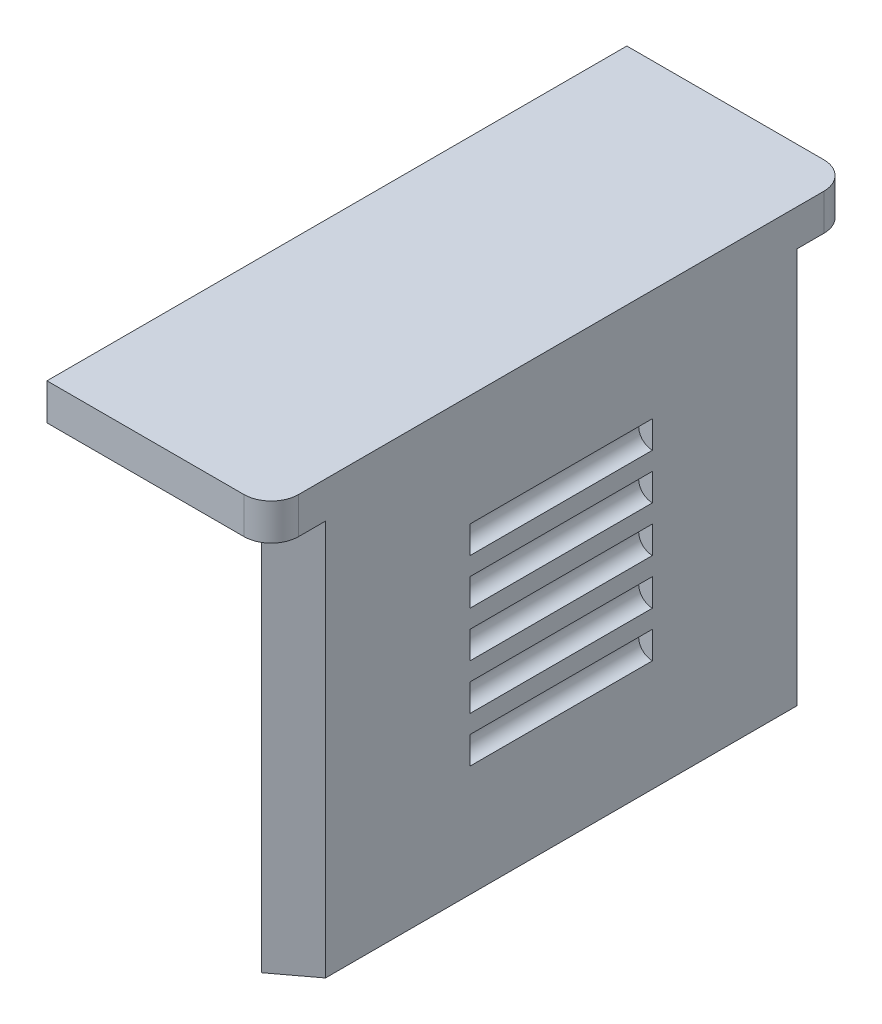
ISO-10303-21;
HEADER;
FILE_DESCRIPTION(('STEP AP214'),'2;1');
FILE_NAME('part.step','',(''),(''),'','','');
FILE_SCHEMA(('AUTOMOTIVE_DESIGN { 1 0 10303 214 1 1 1 1 }'));
ENDSEC;
DATA;
#1=APPLICATION_CONTEXT('core data for automotive mechanical design processes');
#2=APPLICATION_PROTOCOL_DEFINITION('international standard','automotive_design',2000,#1);
#3=PRODUCT_CONTEXT('',#1,'mechanical');
#4=PRODUCT('Part','Part','',(#3));
#5=PRODUCT_RELATED_PRODUCT_CATEGORY('part','',(#4));
#6=PRODUCT_DEFINITION_FORMATION('','',#4);
#7=PRODUCT_DEFINITION_CONTEXT('part definition',#1,'design');
#8=PRODUCT_DEFINITION('design','',#6,#7);
#9=PRODUCT_DEFINITION_SHAPE('','',#8);
#10=(LENGTH_UNIT() NAMED_UNIT(*) SI_UNIT(.MILLI.,.METRE.));
#11=(NAMED_UNIT(*) PLANE_ANGLE_UNIT() SI_UNIT($,.RADIAN.));
#12=(NAMED_UNIT(*) SI_UNIT($,.STERADIAN.) SOLID_ANGLE_UNIT());
#13=UNCERTAINTY_MEASURE_WITH_UNIT(LENGTH_MEASURE(1.E-05),#10,'distance_accuracy_value','');
#14=(GEOMETRIC_REPRESENTATION_CONTEXT(3) GLOBAL_UNCERTAINTY_ASSIGNED_CONTEXT((#13)) GLOBAL_UNIT_ASSIGNED_CONTEXT((#10,
#11,#12)) REPRESENTATION_CONTEXT('',''));
#15=CARTESIAN_POINT('',(0.,0.,0.));
#16=DIRECTION('',(0.,0.,1.));
#17=DIRECTION('',(1.,0.,0.));
#18=AXIS2_PLACEMENT_3D('',#15,#16,#17);
#19=CARTESIAN_POINT('',(-3.65222941321836,109.467949424705,104.21839123638));
#20=DIRECTION('',(1.,0.,0.));
#21=DIRECTION('',(0.,0.,-1.));
#22=AXIS2_PLACEMENT_3D('',#19,#20,#21);
#23=PLANE('',#22);
#24=DIRECTION('',(0.,0.,1.));
#25=VECTOR('',#24,1.);
#26=CARTESIAN_POINT('',(-3.65222941321836,97.867949424705,83.3183912363796));
#27=LINE('',#26,#25);
#28=CARTESIAN_POINT('',(-3.65222941321836,97.867949424705,83.3183912363796));
#29=VERTEX_POINT('',#28);
#30=CARTESIAN_POINT('',(-3.65222941321836,97.867949424705,93.3183912363796));
#31=VERTEX_POINT('',#30);
#32=EDGE_CURVE('E507',#29,#31,#27,.T.);
#33=ORIENTED_EDGE('',*,*,#32,.F.);
#34=DIRECTION('',(0.,-1.,0.));
#35=VECTOR('',#34,1.);
#36=CARTESIAN_POINT('',(-3.65222941321836,109.467949424705,83.3183912363796));
#37=LINE('',#36,#35);
#38=CARTESIAN_POINT('',(-3.65222941321836,96.367949424705,83.3183912363796));
#39=VERTEX_POINT('',#38);
#40=EDGE_CURVE('E205',#29,#39,#37,.T.);
#41=ORIENTED_EDGE('',*,*,#40,.T.);
#42=DIRECTION('',(0.,0.,1.));
#43=VECTOR('',#42,1.);
#44=CARTESIAN_POINT('',(-3.65222941321836,96.367949424705,83.3183912363796));
#45=LINE('',#44,#43);
#46=CARTESIAN_POINT('',(-3.65222941321836,96.367949424705,93.3183912363796));
#47=VERTEX_POINT('',#46);
#48=EDGE_CURVE('E506',#47,#39,#45,.F.);
#49=ORIENTED_EDGE('',*,*,#48,.F.);
#50=DIRECTION('',(0.,-1.,0.));
#51=VECTOR('',#50,1.);
#52=CARTESIAN_POINT('',(-3.65222941321836,109.467949424705,93.3183912363796));
#53=LINE('',#52,#51);
#54=EDGE_CURVE('E511',#31,#47,#53,.T.);
#55=ORIENTED_EDGE('',*,*,#54,.F.);
#56=EDGE_LOOP('',(#33,#41,#49,#55));
#57=FACE_BOUND('',#56,.T.);
#58=DIRECTION('',(0.,0.,1.));
#59=VECTOR('',#58,1.);
#60=CARTESIAN_POINT('',(-3.65222941321836,102.867949424705,83.3183912363796));
#61=LINE('',#60,#59);
#62=CARTESIAN_POINT('',(-3.65222941321836,102.867949424705,83.3183912363796));
#63=VERTEX_POINT('',#62);
#64=CARTESIAN_POINT('',(-3.65222941321836,102.867949424705,93.3183912363796));
#65=VERTEX_POINT('',#64);
#66=EDGE_CURVE('E526',#63,#65,#61,.T.);
#67=ORIENTED_EDGE('',*,*,#66,.F.);
#68=DIRECTION('',(0.,-1.,0.));
#69=VECTOR('',#68,1.);
#70=CARTESIAN_POINT('',(-3.65222941321836,109.467949424705,83.3183912363796));
#71=LINE('',#70,#69);
#72=CARTESIAN_POINT('',(-3.65222941321836,101.367949424705,83.3183912363796));
#73=VERTEX_POINT('',#72);
#74=EDGE_CURVE('E523',#63,#73,#71,.T.);
#75=ORIENTED_EDGE('',*,*,#74,.T.);
#76=DIRECTION('',(0.,0.,1.));
#77=VECTOR('',#76,1.);
#78=CARTESIAN_POINT('',(-3.65222941321836,101.367949424705,83.3183912363796));
#79=LINE('',#78,#77);
#80=CARTESIAN_POINT('',(-3.65222941321836,101.367949424705,93.3183912363796));
#81=VERTEX_POINT('',#80);
#82=EDGE_CURVE('E529',#81,#73,#79,.F.);
#83=ORIENTED_EDGE('',*,*,#82,.F.);
#84=DIRECTION('',(0.,-1.,0.));
#85=VECTOR('',#84,1.);
#86=CARTESIAN_POINT('',(-3.65222941321836,109.467949424705,93.3183912363796));
#87=LINE('',#86,#85);
#88=EDGE_CURVE('E531',#65,#81,#87,.T.);
#89=ORIENTED_EDGE('',*,*,#88,.F.);
#90=EDGE_LOOP('',(#67,#75,#83,#89));
#91=FACE_BOUND('',#90,.T.);
#92=DIRECTION('',(0.,0.,-1.));
#93=VECTOR('',#92,1.);
#94=CARTESIAN_POINT('',(-3.65222941321836,109.467949424705,104.21839123638));
#95=LINE('',#94,#93);
#96=CARTESIAN_POINT('',(-3.65222941321836,109.467949424705,75.3933912363796));
#97=VERTEX_POINT('',#96);
#98=CARTESIAN_POINT('',(-3.65222941321836,109.467949424705,73.9183912363796));
#99=VERTEX_POINT('',#98);
#100=EDGE_CURVE('E226',#97,#99,#95,.T.);
#101=ORIENTED_EDGE('',*,*,#100,.T.);
#102=DIRECTION('',(0.,1.,0.));
#103=VECTOR('',#102,1.);
#104=CARTESIAN_POINT('',(-3.65222941321836,109.467949424705,73.9183912363796));
#105=LINE('',#104,#103);
#106=CARTESIAN_POINT('',(-3.65222941321836,111.467949424705,73.9183912363796));
#107=VERTEX_POINT('',#106);
#108=EDGE_CURVE('E373',#99,#107,#105,.T.);
#109=ORIENTED_EDGE('',*,*,#108,.T.);
#110=DIRECTION('',(0.,0.,-1.));
#111=VECTOR('',#110,1.);
#112=CARTESIAN_POINT('',(-3.65222941321836,111.467949424705,104.21839123638));
#113=LINE('',#112,#111);
#114=CARTESIAN_POINT('',(-3.65222941321836,111.467949424705,102.71839123638));
#115=VERTEX_POINT('',#114);
#116=EDGE_CURVE('E252',#115,#107,#113,.T.);
#117=ORIENTED_EDGE('',*,*,#116,.F.);
#118=DIRECTION('',(0.,1.,0.));
#119=VECTOR('',#118,1.);
#120=CARTESIAN_POINT('',(-3.65222941321836,109.467949424705,102.71839123638));
#121=LINE('',#120,#119);
#122=CARTESIAN_POINT('',(-3.65222941321836,109.467949424705,102.71839123638));
#123=VERTEX_POINT('',#122);
#124=EDGE_CURVE('E221',#115,#123,#121,.F.);
#125=ORIENTED_EDGE('',*,*,#124,.T.);
#126=CARTESIAN_POINT('',(-3.65222941321836,109.467949424705,101.24339123638));
#127=VERTEX_POINT('',#126);
#128=EDGE_CURVE('E222',#123,#127,#95,.T.);
#129=ORIENTED_EDGE('',*,*,#128,.T.);
#130=DIRECTION('',(0.,1.,0.));
#131=VECTOR('',#130,1.);
#132=CARTESIAN_POINT('',(-3.65222941321836,87.767949424705,101.24339123638));
#133=LINE('',#132,#131);
#134=CARTESIAN_POINT('',(-3.65222941321836,87.767949424705,101.24339123638));
#135=VERTEX_POINT('',#134);
#136=EDGE_CURVE('E249',#135,#127,#133,.T.);
#137=ORIENTED_EDGE('',*,*,#136,.F.);
#138=DIRECTION('',(0.,0.,1.));
#139=VECTOR('',#138,1.);
#140=CARTESIAN_POINT('',(-3.65222941321836,87.767949424705,75.3933912363796));
#141=LINE('',#140,#139);
#142=CARTESIAN_POINT('',(-3.65222941321836,87.767949424705,75.3933912363796));
#143=VERTEX_POINT('',#142);
#144=EDGE_CURVE('E259',#143,#135,#141,.T.);
#145=ORIENTED_EDGE('',*,*,#144,.F.);
#146=DIRECTION('',(0.,1.,0.));
#147=VECTOR('',#146,1.);
#148=CARTESIAN_POINT('',(-3.65222941321836,87.767949424705,75.3933912363796));
#149=LINE('',#148,#147);
#150=EDGE_CURVE('E261',#143,#97,#149,.T.);
#151=ORIENTED_EDGE('',*,*,#150,.T.);
#152=EDGE_LOOP('',(#101,#109,#117,#125,#129,#137,#145,#151));
#153=FACE_BOUND('',#152,.T.);
#154=DIRECTION('',(0.,0.,1.));
#155=VECTOR('',#154,1.);
#156=CARTESIAN_POINT('',(-3.65222941321836,105.367949424705,83.3183912363796));
#157=LINE('',#156,#155);
#158=CARTESIAN_POINT('',(-3.65222941321836,105.367949424705,83.3183912363796));
#159=VERTEX_POINT('',#158);
#160=CARTESIAN_POINT('',(-3.65222941321836,105.367949424705,93.3183912363796));
#161=VERTEX_POINT('',#160);
#162=EDGE_CURVE('E536',#159,#161,#157,.T.);
#163=ORIENTED_EDGE('',*,*,#162,.F.);
#164=DIRECTION('',(0.,-1.,0.));
#165=VECTOR('',#164,1.);
#166=CARTESIAN_POINT('',(-3.65222941321836,109.467949424705,83.3183912363796));
#167=LINE('',#166,#165);
#168=CARTESIAN_POINT('',(-3.65222941321836,103.867949424705,83.3183912363796));
#169=VERTEX_POINT('',#168);
#170=EDGE_CURVE('E533',#159,#169,#167,.T.);
#171=ORIENTED_EDGE('',*,*,#170,.T.);
#172=DIRECTION('',(0.,0.,1.));
#173=VECTOR('',#172,1.);
#174=CARTESIAN_POINT('',(-3.65222941321836,103.867949424705,83.3183912363796));
#175=LINE('',#174,#173);
#176=CARTESIAN_POINT('',(-3.65222941321836,103.867949424705,93.3183912363796));
#177=VERTEX_POINT('',#176);
#178=EDGE_CURVE('E405',#177,#169,#175,.F.);
#179=ORIENTED_EDGE('',*,*,#178,.F.);
#180=DIRECTION('',(0.,-1.,0.));
#181=VECTOR('',#180,1.);
#182=CARTESIAN_POINT('',(-3.65222941321836,109.467949424705,93.3183912363796));
#183=LINE('',#182,#181);
#184=EDGE_CURVE('E402',#161,#177,#183,.T.);
#185=ORIENTED_EDGE('',*,*,#184,.F.);
#186=EDGE_LOOP('',(#163,#171,#179,#185));
#187=FACE_BOUND('',#186,.T.);
#188=DIRECTION('',(0.,0.,1.));
#189=VECTOR('',#188,1.);
#190=CARTESIAN_POINT('',(-3.65222941321836,100.367949424705,83.3183912363796));
#191=LINE('',#190,#189);
#192=CARTESIAN_POINT('',(-3.65222941321836,100.367949424705,83.3183912363796));
#193=VERTEX_POINT('',#192);
#194=CARTESIAN_POINT('',(-3.65222941321836,100.367949424705,93.3183912363796));
#195=VERTEX_POINT('',#194);
#196=EDGE_CURVE('E516',#193,#195,#191,.T.);
#197=ORIENTED_EDGE('',*,*,#196,.F.);
#198=DIRECTION('',(0.,-1.,0.));
#199=VECTOR('',#198,1.);
#200=CARTESIAN_POINT('',(-3.65222941321836,109.467949424705,83.3183912363796));
#201=LINE('',#200,#199);
#202=CARTESIAN_POINT('',(-3.65222941321836,98.867949424705,83.3183912363796));
#203=VERTEX_POINT('',#202);
#204=EDGE_CURVE('E513',#193,#203,#201,.T.);
#205=ORIENTED_EDGE('',*,*,#204,.T.);
#206=DIRECTION('',(0.,0.,1.));
#207=VECTOR('',#206,1.);
#208=CARTESIAN_POINT('',(-3.65222941321836,98.867949424705,83.3183912363796));
#209=LINE('',#208,#207);
#210=CARTESIAN_POINT('',(-3.65222941321836,98.867949424705,93.3183912363796));
#211=VERTEX_POINT('',#210);
#212=EDGE_CURVE('E519',#211,#203,#209,.F.);
#213=ORIENTED_EDGE('',*,*,#212,.F.);
#214=DIRECTION('',(0.,-1.,0.));
#215=VECTOR('',#214,1.);
#216=CARTESIAN_POINT('',(-3.65222941321836,109.467949424705,93.3183912363796));
#217=LINE('',#216,#215);
#218=EDGE_CURVE('E521',#195,#211,#217,.T.);
#219=ORIENTED_EDGE('',*,*,#218,.F.);
#220=EDGE_LOOP('',(#197,#205,#213,#219));
#221=FACE_BOUND('',#220,.T.);
#222=DIRECTION('',(0.,0.,1.));
#223=VECTOR('',#222,1.);
#224=CARTESIAN_POINT('',(-3.65222941321836,95.367949424705,83.3183912363796));
#225=LINE('',#224,#223);
#226=CARTESIAN_POINT('',(-3.65222941321836,95.367949424705,83.3183912363796));
#227=VERTEX_POINT('',#226);
#228=CARTESIAN_POINT('',(-3.65222941321836,95.367949424705,93.3183912363796));
#229=VERTEX_POINT('',#228);
#230=EDGE_CURVE('E211',#227,#229,#225,.T.);
#231=ORIENTED_EDGE('',*,*,#230,.F.);
#232=DIRECTION('',(0.,-1.,0.));
#233=VECTOR('',#232,1.);
#234=CARTESIAN_POINT('',(-3.65222941321836,109.467949424705,83.3183912363796));
#235=LINE('',#234,#233);
#236=CARTESIAN_POINT('',(-3.65222941321836,93.867949424705,83.3183912363796));
#237=VERTEX_POINT('',#236);
#238=EDGE_CURVE('E215',#227,#237,#235,.T.);
#239=ORIENTED_EDGE('',*,*,#238,.T.);
#240=DIRECTION('',(0.,0.,1.));
#241=VECTOR('',#240,1.);
#242=CARTESIAN_POINT('',(-3.65222941321836,93.867949424705,83.3183912363796));
#243=LINE('',#242,#241);
#244=CARTESIAN_POINT('',(-3.65222941321836,93.867949424705,93.3183912363796));
#245=VERTEX_POINT('',#244);
#246=EDGE_CURVE('E204',#245,#237,#243,.F.);
#247=ORIENTED_EDGE('',*,*,#246,.F.);
#248=DIRECTION('',(0.,-1.,0.));
#249=VECTOR('',#248,1.);
#250=CARTESIAN_POINT('',(-3.65222941321836,109.467949424705,93.3183912363796));
#251=LINE('',#250,#249);
#252=EDGE_CURVE('E196',#229,#245,#251,.T.);
#253=ORIENTED_EDGE('',*,*,#252,.F.);
#254=EDGE_LOOP('',(#231,#239,#247,#253));
#255=FACE_BOUND('',#254,.T.);
#256=ADVANCED_FACE('F33',(#57,#91,#153,#187,#221,#255),#23,.T.);
#257=CARTESIAN_POINT('',(0.,109.467949424705,0.));
#258=DIRECTION('',(0.,1.,0.));
#259=DIRECTION('',(0.,0.,1.));
#260=AXIS2_PLACEMENT_3D('',#257,#258,#259);
#261=PLANE('',#260);
#262=DIRECTION('',(-1.,0.,0.));
#263=VECTOR('',#262,1.);
#264=CARTESIAN_POINT('',(-3.65222941321836,109.467949424705,72.4183912363796));
#265=LINE('',#264,#263);
#266=CARTESIAN_POINT('',(-5.15222941321836,109.467949424705,72.4183912363796));
#267=VERTEX_POINT('',#266);
#268=CARTESIAN_POINT('',(-15.9522294132184,109.467949424705,72.4183912363796));
#269=VERTEX_POINT('',#268);
#270=EDGE_CURVE('E225',#267,#269,#265,.T.);
#271=ORIENTED_EDGE('',*,*,#270,.F.);
#272=CARTESIAN_POINT('',(-5.15222941321836,109.467949424705,73.9183912363796));
#273=DIRECTION('',(0.,1.,0.));
#274=DIRECTION('',(0.,0.,1.));
#275=AXIS2_PLACEMENT_3D('',#272,#273,#274);
#276=CIRCLE('',#275,1.5);
#277=EDGE_CURVE('E41',#267,#99,#276,.F.);
#278=ORIENTED_EDGE('',*,*,#277,.T.);
#279=ORIENTED_EDGE('',*,*,#100,.F.);
#280=DIRECTION('',(0.799999999999999,0.,0.600000000000001));
#281=VECTOR('',#280,1.);
#282=CARTESIAN_POINT('',(-3.65222941321836,109.467949424705,75.3933912363796));
#283=LINE('',#282,#281);
#284=CARTESIAN_POINT('',(-5.65222941321836,109.467949424705,73.8933912363796));
#285=VERTEX_POINT('',#284);
#286=EDGE_CURVE('E255',#285,#97,#283,.T.);
#287=ORIENTED_EDGE('',*,*,#286,.F.);
#288=DIRECTION('',(0.,0.,-1.));
#289=VECTOR('',#288,1.);
#290=CARTESIAN_POINT('',(-5.65222941321836,109.467949424705,102.74339123638));
#291=LINE('',#290,#289);
#292=CARTESIAN_POINT('',(-5.65222941321836,109.467949424705,80.8183912363796));
#293=VERTEX_POINT('',#292);
#294=EDGE_CURVE('E245',#293,#285,#291,.T.);
#295=ORIENTED_EDGE('',*,*,#294,.F.);
#296=DIRECTION('',(1.,0.,0.));
#297=VECTOR('',#296,1.);
#298=CARTESIAN_POINT('',(-5.65222941321836,109.467949424705,80.8183912363796));
#299=LINE('',#298,#297);
#300=CARTESIAN_POINT('',(-6.65222941321836,109.467949424705,80.8183912363796));
#301=VERTEX_POINT('',#300);
#302=EDGE_CURVE('E296',#301,#293,#299,.T.);
#303=ORIENTED_EDGE('',*,*,#302,.F.);
#304=DIRECTION('',(0.,0.,-1.));
#305=VECTOR('',#304,1.);
#306=CARTESIAN_POINT('',(-6.65222941321836,109.467949424705,95.8183912363796));
#307=LINE('',#306,#305);
#308=CARTESIAN_POINT('',(-6.65222941321836,109.467949424705,95.8183912363796));
#309=VERTEX_POINT('',#308);
#310=EDGE_CURVE('E300',#309,#301,#307,.T.);
#311=ORIENTED_EDGE('',*,*,#310,.F.);
#312=DIRECTION('',(-1.,0.,0.));
#313=VECTOR('',#312,1.);
#314=CARTESIAN_POINT('',(-5.65222941321836,109.467949424705,95.8183912363796));
#315=LINE('',#314,#313);
#316=CARTESIAN_POINT('',(-5.65222941321836,109.467949424705,95.8183912363796));
#317=VERTEX_POINT('',#316);
#318=EDGE_CURVE('E303',#317,#309,#315,.T.);
#319=ORIENTED_EDGE('',*,*,#318,.F.);
#320=CARTESIAN_POINT('',(-5.65222941321836,109.467949424705,102.74339123638));
#321=VERTEX_POINT('',#320);
#322=EDGE_CURVE('E260',#321,#317,#291,.T.);
#323=ORIENTED_EDGE('',*,*,#322,.F.);
#324=DIRECTION('',(-0.799999999999999,0.,0.600000000000001));
#325=VECTOR('',#324,1.);
#326=CARTESIAN_POINT('',(-3.65222941321836,109.467949424705,101.24339123638));
#327=LINE('',#326,#325);
#328=EDGE_CURVE('E242',#127,#321,#327,.T.);
#329=ORIENTED_EDGE('',*,*,#328,.F.);
#330=ORIENTED_EDGE('',*,*,#128,.F.);
#331=CARTESIAN_POINT('',(-5.15222941321836,109.467949424705,102.71839123638));
#332=DIRECTION('',(0.,1.,0.));
#333=DIRECTION('',(0.,0.,1.));
#334=AXIS2_PLACEMENT_3D('',#331,#332,#333);
#335=CIRCLE('',#334,1.5);
#336=CARTESIAN_POINT('',(-5.15222941321836,109.467949424705,104.21839123638));
#337=VERTEX_POINT('',#336);
#338=EDGE_CURVE('E48',#123,#337,#335,.F.);
#339=ORIENTED_EDGE('',*,*,#338,.T.);
#340=DIRECTION('',(1.,0.,0.));
#341=VECTOR('',#340,1.);
#342=CARTESIAN_POINT('',(-15.9522294132184,109.467949424705,104.21839123638));
#343=LINE('',#342,#341);
#344=CARTESIAN_POINT('',(-15.9522294132184,109.467949424705,104.21839123638));
#345=VERTEX_POINT('',#344);
#346=EDGE_CURVE('E391',#345,#337,#343,.T.);
#347=ORIENTED_EDGE('',*,*,#346,.F.);
#348=DIRECTION('',(0.,0.,1.));
#349=VECTOR('',#348,1.);
#350=CARTESIAN_POINT('',(-15.9522294132184,109.467949424705,72.4183912363796));
#351=LINE('',#350,#349);
#352=EDGE_CURVE('E409',#269,#345,#351,.T.);
#353=ORIENTED_EDGE('',*,*,#352,.F.);
#354=EDGE_LOOP('',(#271,#278,#279,#287,#295,#303,#311,#319,#323,#329,#330,#339,#347,#353));
#355=FACE_BOUND('',#354,.T.);
#356=ADVANCED_FACE('F351',(#355),#261,.F.);
#357=CARTESIAN_POINT('',(-5.65222941321836,87.767949424705,102.74339123638));
#358=DIRECTION('',(1.,0.,0.));
#359=DIRECTION('',(0.,0.,-1.));
#360=AXIS2_PLACEMENT_3D('',#357,#358,#359);
#361=PLANE('',#360);
#362=DIRECTION('',(0.,1.,0.));
#363=VECTOR('',#362,1.);
#364=CARTESIAN_POINT('',(-5.65222941321836,89.467949424705,95.8183912363796));
#365=LINE('',#364,#363);
#366=CARTESIAN_POINT('',(-5.65222941321836,89.467949424705,95.8183912363796));
#367=VERTEX_POINT('',#366);
#368=EDGE_CURVE('E246',#367,#317,#365,.T.);
#369=ORIENTED_EDGE('',*,*,#368,.F.);
#370=DIRECTION('',(0.,0.,1.));
#371=VECTOR('',#370,1.);
#372=CARTESIAN_POINT('',(-5.65222941321836,89.467949424705,95.8183912363796));
#373=LINE('',#372,#371);
#374=CARTESIAN_POINT('',(-5.65222941321836,89.467949424705,80.8183912363796));
#375=VERTEX_POINT('',#374);
#376=EDGE_CURVE('E299',#375,#367,#373,.T.);
#377=ORIENTED_EDGE('',*,*,#376,.F.);
#378=DIRECTION('',(0.,1.,0.));
#379=VECTOR('',#378,1.);
#380=CARTESIAN_POINT('',(-5.65222941321836,89.467949424705,80.8183912363796));
#381=LINE('',#380,#379);
#382=EDGE_CURVE('E293',#375,#293,#381,.T.);
#383=ORIENTED_EDGE('',*,*,#382,.T.);
#384=ORIENTED_EDGE('',*,*,#294,.T.);
#385=DIRECTION('',(0.,1.,0.));
#386=VECTOR('',#385,1.);
#387=CARTESIAN_POINT('',(-5.65222941321836,87.767949424705,73.8933912363796));
#388=LINE('',#387,#386);
#389=CARTESIAN_POINT('',(-5.65222941321836,87.767949424705,73.8933912363796));
#390=VERTEX_POINT('',#389);
#391=EDGE_CURVE('E266',#390,#285,#388,.T.);
#392=ORIENTED_EDGE('',*,*,#391,.F.);
#393=DIRECTION('',(0.,0.,-1.));
#394=VECTOR('',#393,1.);
#395=CARTESIAN_POINT('',(-5.65222941321836,87.767949424705,102.74339123638));
#396=LINE('',#395,#394);
#397=CARTESIAN_POINT('',(-5.65222941321836,87.767949424705,102.74339123638));
#398=VERTEX_POINT('',#397);
#399=EDGE_CURVE('E277',#398,#390,#396,.T.);
#400=ORIENTED_EDGE('',*,*,#399,.F.);
#401=DIRECTION('',(0.,1.,0.));
#402=VECTOR('',#401,1.);
#403=CARTESIAN_POINT('',(-5.65222941321836,87.767949424705,102.74339123638));
#404=LINE('',#403,#402);
#405=EDGE_CURVE('E231',#398,#321,#404,.T.);
#406=ORIENTED_EDGE('',*,*,#405,.T.);
#407=ORIENTED_EDGE('',*,*,#322,.T.);
#408=EDGE_LOOP('',(#369,#377,#383,#384,#392,#400,#406,#407));
#409=FACE_BOUND('',#408,.T.);
#410=ADVANCED_FACE('F357',(#409),#361,.F.);
#411=CARTESIAN_POINT('',(-15.9522294132184,109.467949424705,104.21839123638));
#412=DIRECTION('',(0.,0.,1.));
#413=DIRECTION('',(1.,0.,0.));
#414=AXIS2_PLACEMENT_3D('',#411,#412,#413);
#415=PLANE('',#414);
#416=ORIENTED_EDGE('',*,*,#346,.T.);
#417=DIRECTION('',(0.,1.,0.));
#418=VECTOR('',#417,1.);
#419=CARTESIAN_POINT('',(-5.15222941321836,109.467949424705,104.21839123638));
#420=LINE('',#419,#418);
#421=CARTESIAN_POINT('',(-5.15222941321836,111.467949424705,104.21839123638));
#422=VERTEX_POINT('',#421);
#423=EDGE_CURVE('E11',#337,#422,#420,.T.);
#424=ORIENTED_EDGE('',*,*,#423,.T.);
#425=DIRECTION('',(1.,0.,0.));
#426=VECTOR('',#425,1.);
#427=CARTESIAN_POINT('',(-15.9522294132184,111.467949424705,104.21839123638));
#428=LINE('',#427,#426);
#429=CARTESIAN_POINT('',(-15.9522294132184,111.467949424705,104.21839123638));
#430=VERTEX_POINT('',#429);
#431=EDGE_CURVE('E239',#430,#422,#428,.T.);
#432=ORIENTED_EDGE('',*,*,#431,.F.);
#433=DIRECTION('',(0.,1.,0.));
#434=VECTOR('',#433,1.);
#435=CARTESIAN_POINT('',(-15.9522294132184,109.467949424705,104.21839123638));
#436=LINE('',#435,#434);
#437=EDGE_CURVE('E401',#345,#430,#436,.T.);
#438=ORIENTED_EDGE('',*,*,#437,.F.);
#439=EDGE_LOOP('',(#416,#424,#432,#438));
#440=FACE_BOUND('',#439,.T.);
#441=ADVANCED_FACE('F390',(#440),#415,.T.);
#442=CARTESIAN_POINT('',(-15.9522294132184,109.467949424705,72.4183912363796));
#443=DIRECTION('',(-1.,0.,0.));
#444=DIRECTION('',(0.,0.,1.));
#445=AXIS2_PLACEMENT_3D('',#442,#443,#444);
#446=PLANE('',#445);
#447=DIRECTION('',(0.,0.,1.));
#448=VECTOR('',#447,1.);
#449=CARTESIAN_POINT('',(-15.9522294132184,111.467949424705,72.4183912363796));
#450=LINE('',#449,#448);
#451=CARTESIAN_POINT('',(-15.9522294132184,111.467949424705,72.4183912363796));
#452=VERTEX_POINT('',#451);
#453=EDGE_CURVE('E396',#452,#430,#450,.T.);
#454=ORIENTED_EDGE('',*,*,#453,.F.);
#455=DIRECTION('',(0.,1.,0.));
#456=VECTOR('',#455,1.);
#457=CARTESIAN_POINT('',(-15.9522294132184,109.467949424705,72.4183912363796));
#458=LINE('',#457,#456);
#459=EDGE_CURVE('E240',#269,#452,#458,.T.);
#460=ORIENTED_EDGE('',*,*,#459,.F.);
#461=ORIENTED_EDGE('',*,*,#352,.T.);
#462=ORIENTED_EDGE('',*,*,#437,.T.);
#463=EDGE_LOOP('',(#454,#460,#461,#462));
#464=FACE_BOUND('',#463,.T.);
#465=ADVANCED_FACE('F413',(#464),#446,.T.);
#466=CARTESIAN_POINT('',(-3.65222941321836,109.467949424705,72.4183912363796));
#467=DIRECTION('',(0.,0.,-1.));
#468=DIRECTION('',(-1.,0.,0.));
#469=AXIS2_PLACEMENT_3D('',#466,#467,#468);
#470=PLANE('',#469);
#471=DIRECTION('',(-1.,0.,0.));
#472=VECTOR('',#471,1.);
#473=CARTESIAN_POINT('',(-3.65222941321836,111.467949424705,72.4183912363796));
#474=LINE('',#473,#472);
#475=CARTESIAN_POINT('',(-5.15222941321836,111.467949424705,72.4183912363796));
#476=VERTEX_POINT('',#475);
#477=EDGE_CURVE('E398',#476,#452,#474,.T.);
#478=ORIENTED_EDGE('',*,*,#477,.F.);
#479=DIRECTION('',(0.,1.,0.));
#480=VECTOR('',#479,1.);
#481=CARTESIAN_POINT('',(-5.15222941321836,109.467949424705,72.4183912363796));
#482=LINE('',#481,#480);
#483=EDGE_CURVE('E56',#476,#267,#482,.F.);
#484=ORIENTED_EDGE('',*,*,#483,.T.);
#485=ORIENTED_EDGE('',*,*,#270,.T.);
#486=ORIENTED_EDGE('',*,*,#459,.T.);
#487=EDGE_LOOP('',(#478,#484,#485,#486));
#488=FACE_BOUND('',#487,.T.);
#489=ADVANCED_FACE('F362',(#488),#470,.T.);
#490=CARTESIAN_POINT('',(0.,111.467949424705,0.));
#491=DIRECTION('',(0.,1.,0.));
#492=DIRECTION('',(0.,0.,1.));
#493=AXIS2_PLACEMENT_3D('',#490,#491,#492);
#494=PLANE('',#493);
#495=ORIENTED_EDGE('',*,*,#116,.T.);
#496=CARTESIAN_POINT('',(-5.15222941321836,111.467949424705,73.9183912363796));
#497=DIRECTION('',(0.,1.,0.));
#498=DIRECTION('',(0.,0.,1.));
#499=AXIS2_PLACEMENT_3D('',#496,#497,#498);
#500=CIRCLE('',#499,1.5);
#501=EDGE_CURVE('E377',#107,#476,#500,.T.);
#502=ORIENTED_EDGE('',*,*,#501,.T.);
#503=ORIENTED_EDGE('',*,*,#477,.T.);
#504=ORIENTED_EDGE('',*,*,#453,.T.);
#505=ORIENTED_EDGE('',*,*,#431,.T.);
#506=CARTESIAN_POINT('',(-5.15222941321836,111.467949424705,102.71839123638));
#507=DIRECTION('',(0.,1.,0.));
#508=DIRECTION('',(0.,0.,1.));
#509=AXIS2_PLACEMENT_3D('',#506,#507,#508);
#510=CIRCLE('',#509,1.5);
#511=EDGE_CURVE('E379',#422,#115,#510,.T.);
#512=ORIENTED_EDGE('',*,*,#511,.T.);
#513=EDGE_LOOP('',(#495,#502,#503,#504,#505,#512));
#514=FACE_BOUND('',#513,.T.);
#515=ADVANCED_FACE('F394',(#514),#494,.T.);
#516=CARTESIAN_POINT('',(-3.65222941321836,87.767949424705,101.24339123638));
#517=DIRECTION('',(-0.600000000000001,0.,-0.799999999999999));
#518=DIRECTION('',(-0.799999999999999,0.,0.600000000000001));
#519=AXIS2_PLACEMENT_3D('',#516,#517,#518);
#520=PLANE('',#519);
#521=ORIENTED_EDGE('',*,*,#328,.T.);
#522=ORIENTED_EDGE('',*,*,#405,.F.);
#523=DIRECTION('',(-0.799999999999999,0.,0.600000000000001));
#524=VECTOR('',#523,1.);
#525=CARTESIAN_POINT('',(-3.65222941321836,87.767949424705,101.24339123638));
#526=LINE('',#525,#524);
#527=EDGE_CURVE('E280',#135,#398,#526,.T.);
#528=ORIENTED_EDGE('',*,*,#527,.F.);
#529=ORIENTED_EDGE('',*,*,#136,.T.);
#530=EDGE_LOOP('',(#521,#522,#528,#529));
#531=FACE_BOUND('',#530,.T.);
#532=ADVANCED_FACE('F418',(#531),#520,.F.);
#533=CARTESIAN_POINT('',(-3.65222941321836,87.767949424705,75.3933912363796));
#534=DIRECTION('',(-0.600000000000001,0.,0.799999999999999));
#535=DIRECTION('',(0.799999999999999,0.,0.600000000000001));
#536=AXIS2_PLACEMENT_3D('',#533,#534,#535);
#537=PLANE('',#536);
#538=ORIENTED_EDGE('',*,*,#286,.T.);
#539=ORIENTED_EDGE('',*,*,#150,.F.);
#540=DIRECTION('',(0.799999999999999,0.,0.600000000000001));
#541=VECTOR('',#540,1.);
#542=CARTESIAN_POINT('',(-3.65222941321836,87.767949424705,75.3933912363796));
#543=LINE('',#542,#541);
#544=EDGE_CURVE('E273',#390,#143,#543,.T.);
#545=ORIENTED_EDGE('',*,*,#544,.F.);
#546=ORIENTED_EDGE('',*,*,#391,.T.);
#547=EDGE_LOOP('',(#538,#539,#545,#546));
#548=FACE_BOUND('',#547,.T.);
#549=ADVANCED_FACE('F427',(#548),#537,.F.);
#550=CARTESIAN_POINT('',(0.,87.767949424705,0.));
#551=DIRECTION('',(0.,-1.,0.));
#552=DIRECTION('',(0.,0.,-1.));
#553=AXIS2_PLACEMENT_3D('',#550,#551,#552);
#554=PLANE('',#553);
#555=ORIENTED_EDGE('',*,*,#144,.T.);
#556=ORIENTED_EDGE('',*,*,#527,.T.);
#557=ORIENTED_EDGE('',*,*,#399,.T.);
#558=ORIENTED_EDGE('',*,*,#544,.T.);
#559=EDGE_LOOP('',(#555,#556,#557,#558));
#560=FACE_BOUND('',#559,.T.);
#561=ADVANCED_FACE('F434',(#560),#554,.T.);
#562=CARTESIAN_POINT('',(-5.65222941321836,89.467949424705,95.8183912363796));
#563=DIRECTION('',(0.,0.,-1.));
#564=DIRECTION('',(-1.,0.,0.));
#565=AXIS2_PLACEMENT_3D('',#562,#563,#564);
#566=PLANE('',#565);
#567=ORIENTED_EDGE('',*,*,#318,.T.);
#568=DIRECTION('',(0.,1.,0.));
#569=VECTOR('',#568,1.);
#570=CARTESIAN_POINT('',(-6.65222941321836,89.467949424705,95.8183912363796));
#571=LINE('',#570,#569);
#572=CARTESIAN_POINT('',(-6.65222941321836,89.467949424705,95.8183912363796));
#573=VERTEX_POINT('',#572);
#574=EDGE_CURVE('E287',#573,#309,#571,.T.);
#575=ORIENTED_EDGE('',*,*,#574,.F.);
#576=DIRECTION('',(-1.,0.,0.));
#577=VECTOR('',#576,1.);
#578=CARTESIAN_POINT('',(-5.65222941321836,89.467949424705,95.8183912363796));
#579=LINE('',#578,#577);
#580=EDGE_CURVE('E311',#367,#573,#579,.T.);
#581=ORIENTED_EDGE('',*,*,#580,.F.);
#582=ORIENTED_EDGE('',*,*,#368,.T.);
#583=EDGE_LOOP('',(#567,#575,#581,#582));
#584=FACE_BOUND('',#583,.T.);
#585=ADVANCED_FACE('F437',(#584),#566,.F.);
#586=CARTESIAN_POINT('',(-6.65222941321836,89.467949424705,95.8183912363796));
#587=DIRECTION('',(1.,0.,0.));
#588=DIRECTION('',(0.,0.,-1.));
#589=AXIS2_PLACEMENT_3D('',#586,#587,#588);
#590=PLANE('',#589);
#591=ORIENTED_EDGE('',*,*,#310,.T.);
#592=DIRECTION('',(0.,1.,0.));
#593=VECTOR('',#592,1.);
#594=CARTESIAN_POINT('',(-6.65222941321836,89.467949424705,80.8183912363796));
#595=LINE('',#594,#593);
#596=CARTESIAN_POINT('',(-6.65222941321836,89.467949424705,80.8183912363796));
#597=VERTEX_POINT('',#596);
#598=EDGE_CURVE('E290',#597,#301,#595,.T.);
#599=ORIENTED_EDGE('',*,*,#598,.F.);
#600=DIRECTION('',(0.,0.,-1.));
#601=VECTOR('',#600,1.);
#602=CARTESIAN_POINT('',(-6.65222941321836,89.467949424705,95.8183912363796));
#603=LINE('',#602,#601);
#604=EDGE_CURVE('E309',#573,#597,#603,.T.);
#605=ORIENTED_EDGE('',*,*,#604,.F.);
#606=ORIENTED_EDGE('',*,*,#574,.T.);
#607=EDGE_LOOP('',(#591,#599,#605,#606));
#608=FACE_BOUND('',#607,.T.);
#609=ADVANCED_FACE('F440',(#608),#590,.F.);
#610=CARTESIAN_POINT('',(-5.65222941321836,89.467949424705,80.8183912363796));
#611=DIRECTION('',(0.,0.,1.));
#612=DIRECTION('',(1.,0.,0.));
#613=AXIS2_PLACEMENT_3D('',#610,#611,#612);
#614=PLANE('',#613);
#615=ORIENTED_EDGE('',*,*,#302,.T.);
#616=ORIENTED_EDGE('',*,*,#382,.F.);
#617=DIRECTION('',(1.,0.,0.));
#618=VECTOR('',#617,1.);
#619=CARTESIAN_POINT('',(-5.65222941321836,89.467949424705,80.8183912363796));
#620=LINE('',#619,#618);
#621=EDGE_CURVE('E295',#597,#375,#620,.T.);
#622=ORIENTED_EDGE('',*,*,#621,.F.);
#623=ORIENTED_EDGE('',*,*,#598,.T.);
#624=EDGE_LOOP('',(#615,#616,#622,#623));
#625=FACE_BOUND('',#624,.T.);
#626=ADVANCED_FACE('F444',(#625),#614,.F.);
#627=CARTESIAN_POINT('',(0.,89.467949424705,0.));
#628=DIRECTION('',(0.,1.,0.));
#629=DIRECTION('',(0.,0.,1.));
#630=AXIS2_PLACEMENT_3D('',#627,#628,#629);
#631=PLANE('',#630);
#632=ORIENTED_EDGE('',*,*,#376,.T.);
#633=ORIENTED_EDGE('',*,*,#580,.T.);
#634=ORIENTED_EDGE('',*,*,#604,.T.);
#635=ORIENTED_EDGE('',*,*,#621,.T.);
#636=EDGE_LOOP('',(#632,#633,#634,#635));
#637=FACE_BOUND('',#636,.T.);
#638=ADVANCED_FACE('F448',(#637),#631,.F.);
#639=CARTESIAN_POINT('',(-3.65222941321836,104.617949424705,83.3183912363796));
#640=DIRECTION('',(0.,0.,1.));
#641=DIRECTION('',(1.,0.,0.));
#642=AXIS2_PLACEMENT_3D('',#639,#640,#641);
#643=CYLINDRICAL_SURFACE('',#642,0.749999999999999);
#644=ORIENTED_EDGE('',*,*,#162,.T.);
#645=CARTESIAN_POINT('',(-3.65222941321836,104.617949424705,93.3183912363796));
#646=DIRECTION('',(0.,0.,1.));
#647=DIRECTION('',(1.,0.,0.));
#648=AXIS2_PLACEMENT_3D('',#645,#646,#647);
#649=CIRCLE('',#648,0.749999999999999);
#650=EDGE_CURVE('E315',#161,#177,#649,.T.);
#651=ORIENTED_EDGE('',*,*,#650,.T.);
#652=ORIENTED_EDGE('',*,*,#178,.T.);
#653=CARTESIAN_POINT('',(-3.65222941321836,104.617949424705,83.3183912363796));
#654=DIRECTION('',(0.,0.,1.));
#655=DIRECTION('',(1.,0.,0.));
#656=AXIS2_PLACEMENT_3D('',#653,#654,#655);
#657=CIRCLE('',#656,0.749999999999999);
#658=EDGE_CURVE('E306',#159,#169,#657,.T.);
#659=ORIENTED_EDGE('',*,*,#658,.F.);
#660=EDGE_LOOP('',(#644,#651,#652,#659));
#661=FACE_BOUND('',#660,.T.);
#662=ADVANCED_FACE('F452',(#661),#643,.F.);
#663=CARTESIAN_POINT('',(-3.65222941321836,104.617949424705,83.3183912363796));
#664=DIRECTION('',(0.,0.,1.));
#665=DIRECTION('',(1.,0.,0.));
#666=AXIS2_PLACEMENT_3D('',#663,#664,#665);
#667=PLANE('',#666);
#668=ORIENTED_EDGE('',*,*,#658,.T.);
#669=ORIENTED_EDGE('',*,*,#170,.F.);
#670=EDGE_LOOP('',(#668,#669));
#671=FACE_BOUND('',#670,.T.);
#672=ADVANCED_FACE('F456',(#671),#667,.T.);
#673=CARTESIAN_POINT('',(-3.65222941321836,104.617949424705,93.3183912363796));
#674=DIRECTION('',(0.,0.,1.));
#675=DIRECTION('',(1.,0.,0.));
#676=AXIS2_PLACEMENT_3D('',#673,#674,#675);
#677=PLANE('',#676);
#678=ORIENTED_EDGE('',*,*,#184,.T.);
#679=ORIENTED_EDGE('',*,*,#650,.F.);
#680=EDGE_LOOP('',(#678,#679));
#681=FACE_BOUND('',#680,.T.);
#682=ADVANCED_FACE('F458',(#681),#677,.F.);
#683=CARTESIAN_POINT('',(-3.65222941321836,102.117949424705,83.3183912363796));
#684=DIRECTION('',(0.,0.,1.));
#685=DIRECTION('',(1.,0.,0.));
#686=AXIS2_PLACEMENT_3D('',#683,#684,#685);
#687=CYLINDRICAL_SURFACE('',#686,0.749999999999999);
#688=ORIENTED_EDGE('',*,*,#66,.T.);
#689=CARTESIAN_POINT('',(-3.65222941321836,102.117949424705,93.3183912363796));
#690=DIRECTION('',(0.,0.,1.));
#691=DIRECTION('',(1.,0.,0.));
#692=AXIS2_PLACEMENT_3D('',#689,#690,#691);
#693=CIRCLE('',#692,0.749999999999999);
#694=EDGE_CURVE('E321',#65,#81,#693,.T.);
#695=ORIENTED_EDGE('',*,*,#694,.T.);
#696=ORIENTED_EDGE('',*,*,#82,.T.);
#697=CARTESIAN_POINT('',(-3.65222941321836,102.117949424705,83.3183912363796));
#698=DIRECTION('',(0.,0.,1.));
#699=DIRECTION('',(1.,0.,0.));
#700=AXIS2_PLACEMENT_3D('',#697,#698,#699);
#701=CIRCLE('',#700,0.749999999999999);
#702=EDGE_CURVE('E318',#63,#73,#701,.T.);
#703=ORIENTED_EDGE('',*,*,#702,.F.);
#704=EDGE_LOOP('',(#688,#695,#696,#703));
#705=FACE_BOUND('',#704,.T.);
#706=ADVANCED_FACE('F461',(#705),#687,.F.);
#707=CARTESIAN_POINT('',(-3.65222941321836,102.117949424705,83.3183912363796));
#708=DIRECTION('',(0.,0.,1.));
#709=DIRECTION('',(1.,0.,0.));
#710=AXIS2_PLACEMENT_3D('',#707,#708,#709);
#711=PLANE('',#710);
#712=ORIENTED_EDGE('',*,*,#702,.T.);
#713=ORIENTED_EDGE('',*,*,#74,.F.);
#714=EDGE_LOOP('',(#712,#713));
#715=FACE_BOUND('',#714,.T.);
#716=ADVANCED_FACE('F468',(#715),#711,.T.);
#717=CARTESIAN_POINT('',(-3.65222941321836,102.117949424705,93.3183912363796));
#718=DIRECTION('',(0.,0.,1.));
#719=DIRECTION('',(1.,0.,0.));
#720=AXIS2_PLACEMENT_3D('',#717,#718,#719);
#721=PLANE('',#720);
#722=ORIENTED_EDGE('',*,*,#88,.T.);
#723=ORIENTED_EDGE('',*,*,#694,.F.);
#724=EDGE_LOOP('',(#722,#723));
#725=FACE_BOUND('',#724,.T.);
#726=ADVANCED_FACE('F470',(#725),#721,.F.);
#727=CARTESIAN_POINT('',(-3.65222941321836,99.617949424705,83.3183912363796));
#728=DIRECTION('',(0.,0.,1.));
#729=DIRECTION('',(1.,0.,0.));
#730=AXIS2_PLACEMENT_3D('',#727,#728,#729);
#731=CYLINDRICAL_SURFACE('',#730,0.749999999999999);
#732=ORIENTED_EDGE('',*,*,#196,.T.);
#733=CARTESIAN_POINT('',(-3.65222941321836,99.617949424705,93.3183912363796));
#734=DIRECTION('',(0.,0.,1.));
#735=DIRECTION('',(1.,0.,0.));
#736=AXIS2_PLACEMENT_3D('',#733,#734,#735);
#737=CIRCLE('',#736,0.749999999999999);
#738=EDGE_CURVE('E327',#195,#211,#737,.T.);
#739=ORIENTED_EDGE('',*,*,#738,.T.);
#740=ORIENTED_EDGE('',*,*,#212,.T.);
#741=CARTESIAN_POINT('',(-3.65222941321836,99.617949424705,83.3183912363796));
#742=DIRECTION('',(0.,0.,1.));
#743=DIRECTION('',(1.,0.,0.));
#744=AXIS2_PLACEMENT_3D('',#741,#742,#743);
#745=CIRCLE('',#744,0.749999999999999);
#746=EDGE_CURVE('E324',#193,#203,#745,.T.);
#747=ORIENTED_EDGE('',*,*,#746,.F.);
#748=EDGE_LOOP('',(#732,#739,#740,#747));
#749=FACE_BOUND('',#748,.T.);
#750=ADVANCED_FACE('F473',(#749),#731,.F.);
#751=CARTESIAN_POINT('',(-3.65222941321836,99.617949424705,83.3183912363796));
#752=DIRECTION('',(0.,0.,1.));
#753=DIRECTION('',(1.,0.,0.));
#754=AXIS2_PLACEMENT_3D('',#751,#752,#753);
#755=PLANE('',#754);
#756=ORIENTED_EDGE('',*,*,#746,.T.);
#757=ORIENTED_EDGE('',*,*,#204,.F.);
#758=EDGE_LOOP('',(#756,#757));
#759=FACE_BOUND('',#758,.T.);
#760=ADVANCED_FACE('F480',(#759),#755,.T.);
#761=CARTESIAN_POINT('',(-3.65222941321836,99.617949424705,93.3183912363796));
#762=DIRECTION('',(0.,0.,1.));
#763=DIRECTION('',(1.,0.,0.));
#764=AXIS2_PLACEMENT_3D('',#761,#762,#763);
#765=PLANE('',#764);
#766=ORIENTED_EDGE('',*,*,#218,.T.);
#767=ORIENTED_EDGE('',*,*,#738,.F.);
#768=EDGE_LOOP('',(#766,#767));
#769=FACE_BOUND('',#768,.T.);
#770=ADVANCED_FACE('F482',(#769),#765,.F.);
#771=CARTESIAN_POINT('',(-3.65222941321836,97.117949424705,83.3183912363796));
#772=DIRECTION('',(0.,0.,1.));
#773=DIRECTION('',(1.,0.,0.));
#774=AXIS2_PLACEMENT_3D('',#771,#772,#773);
#775=CYLINDRICAL_SURFACE('',#774,0.749999999999999);
#776=ORIENTED_EDGE('',*,*,#32,.T.);
#777=CARTESIAN_POINT('',(-3.65222941321836,97.117949424705,93.3183912363796));
#778=DIRECTION('',(0.,0.,1.));
#779=DIRECTION('',(1.,0.,0.));
#780=AXIS2_PLACEMENT_3D('',#777,#778,#779);
#781=CIRCLE('',#780,0.749999999999999);
#782=EDGE_CURVE('E333',#31,#47,#781,.T.);
#783=ORIENTED_EDGE('',*,*,#782,.T.);
#784=ORIENTED_EDGE('',*,*,#48,.T.);
#785=CARTESIAN_POINT('',(-3.65222941321836,97.117949424705,83.3183912363796));
#786=DIRECTION('',(0.,0.,1.));
#787=DIRECTION('',(1.,0.,0.));
#788=AXIS2_PLACEMENT_3D('',#785,#786,#787);
#789=CIRCLE('',#788,0.749999999999999);
#790=EDGE_CURVE('E330',#29,#39,#789,.T.);
#791=ORIENTED_EDGE('',*,*,#790,.F.);
#792=EDGE_LOOP('',(#776,#783,#784,#791));
#793=FACE_BOUND('',#792,.T.);
#794=ADVANCED_FACE('F485',(#793),#775,.F.);
#795=CARTESIAN_POINT('',(-3.65222941321836,97.117949424705,83.3183912363796));
#796=DIRECTION('',(0.,0.,1.));
#797=DIRECTION('',(1.,0.,0.));
#798=AXIS2_PLACEMENT_3D('',#795,#796,#797);
#799=PLANE('',#798);
#800=ORIENTED_EDGE('',*,*,#790,.T.);
#801=ORIENTED_EDGE('',*,*,#40,.F.);
#802=EDGE_LOOP('',(#800,#801));
#803=FACE_BOUND('',#802,.T.);
#804=ADVANCED_FACE('F492',(#803),#799,.T.);
#805=CARTESIAN_POINT('',(-3.65222941321836,97.117949424705,93.3183912363796));
#806=DIRECTION('',(0.,0.,1.));
#807=DIRECTION('',(1.,0.,0.));
#808=AXIS2_PLACEMENT_3D('',#805,#806,#807);
#809=PLANE('',#808);
#810=ORIENTED_EDGE('',*,*,#54,.T.);
#811=ORIENTED_EDGE('',*,*,#782,.F.);
#812=EDGE_LOOP('',(#810,#811));
#813=FACE_BOUND('',#812,.T.);
#814=ADVANCED_FACE('F348',(#813),#809,.F.);
#815=CARTESIAN_POINT('',(-3.65222941321836,94.617949424705,83.3183912363796));
#816=DIRECTION('',(0.,0.,1.));
#817=DIRECTION('',(1.,0.,0.));
#818=AXIS2_PLACEMENT_3D('',#815,#816,#817);
#819=CYLINDRICAL_SURFACE('',#818,0.749999999999999);
#820=ORIENTED_EDGE('',*,*,#230,.T.);
#821=CARTESIAN_POINT('',(-3.65222941321836,94.617949424705,93.3183912363796));
#822=DIRECTION('',(0.,0.,1.));
#823=DIRECTION('',(1.,0.,0.));
#824=AXIS2_PLACEMENT_3D('',#821,#822,#823);
#825=CIRCLE('',#824,0.749999999999999);
#826=EDGE_CURVE('E199',#229,#245,#825,.T.);
#827=ORIENTED_EDGE('',*,*,#826,.T.);
#828=ORIENTED_EDGE('',*,*,#246,.T.);
#829=CARTESIAN_POINT('',(-3.65222941321836,94.617949424705,83.3183912363796));
#830=DIRECTION('',(0.,0.,1.));
#831=DIRECTION('',(1.,0.,0.));
#832=AXIS2_PLACEMENT_3D('',#829,#830,#831);
#833=CIRCLE('',#832,0.749999999999999);
#834=EDGE_CURVE('E212',#227,#237,#833,.T.);
#835=ORIENTED_EDGE('',*,*,#834,.F.);
#836=EDGE_LOOP('',(#820,#827,#828,#835));
#837=FACE_BOUND('',#836,.T.);
#838=ADVANCED_FACE('F208',(#837),#819,.F.);
#839=CARTESIAN_POINT('',(-3.65222941321836,94.617949424705,83.3183912363796));
#840=DIRECTION('',(0.,0.,1.));
#841=DIRECTION('',(1.,0.,0.));
#842=AXIS2_PLACEMENT_3D('',#839,#840,#841);
#843=PLANE('',#842);
#844=ORIENTED_EDGE('',*,*,#834,.T.);
#845=ORIENTED_EDGE('',*,*,#238,.F.);
#846=EDGE_LOOP('',(#844,#845));
#847=FACE_BOUND('',#846,.T.);
#848=ADVANCED_FACE('F339',(#847),#843,.T.);
#849=CARTESIAN_POINT('',(-3.65222941321836,94.617949424705,93.3183912363796));
#850=DIRECTION('',(0.,0.,1.));
#851=DIRECTION('',(1.,0.,0.));
#852=AXIS2_PLACEMENT_3D('',#849,#850,#851);
#853=PLANE('',#852);
#854=ORIENTED_EDGE('',*,*,#252,.T.);
#855=ORIENTED_EDGE('',*,*,#826,.F.);
#856=EDGE_LOOP('',(#854,#855));
#857=FACE_BOUND('',#856,.T.);
#858=ADVANCED_FACE('F198',(#857),#853,.F.);
#859=CARTESIAN_POINT('',(-5.15222941321836,109.467949424705,73.9183912363796));
#860=DIRECTION('',(0.,1.,0.));
#861=DIRECTION('',(0.,0.,1.));
#862=AXIS2_PLACEMENT_3D('',#859,#860,#861);
#863=CYLINDRICAL_SURFACE('',#862,1.5);
#864=ORIENTED_EDGE('',*,*,#277,.F.);
#865=ORIENTED_EDGE('',*,*,#483,.F.);
#866=ORIENTED_EDGE('',*,*,#501,.F.);
#867=ORIENTED_EDGE('',*,*,#108,.F.);
#868=EDGE_LOOP('',(#864,#865,#866,#867));
#869=FACE_BOUND('',#868,.T.);
#870=ADVANCED_FACE('F346',(#869),#863,.T.);
#871=CARTESIAN_POINT('',(-5.15222941321836,109.467949424705,102.71839123638));
#872=DIRECTION('',(0.,1.,0.));
#873=DIRECTION('',(0.,0.,1.));
#874=AXIS2_PLACEMENT_3D('',#871,#872,#873);
#875=CYLINDRICAL_SURFACE('',#874,1.5);
#876=ORIENTED_EDGE('',*,*,#338,.F.);
#877=ORIENTED_EDGE('',*,*,#124,.F.);
#878=ORIENTED_EDGE('',*,*,#511,.F.);
#879=ORIENTED_EDGE('',*,*,#423,.F.);
#880=EDGE_LOOP('',(#876,#877,#878,#879));
#881=FACE_BOUND('',#880,.T.);
#882=ADVANCED_FACE('F35',(#881),#875,.T.);
#883=CLOSED_SHELL('',(#256,#356,#410,#441,#465,#489,#515,#532,#549,#561,#585,#609,#626,#638,
#662,#672,#682,#706,#716,#726,#750,#760,#770,#794,#804,#814,#838,#848,#858,#870,#882));
#884=MANIFOLD_SOLID_BREP('B2',#883);
#885=ADVANCED_BREP_SHAPE_REPRESENTATION('',(#18,#884),#14);
#886=SHAPE_DEFINITION_REPRESENTATION(#9,#885);
ENDSEC;
END-ISO-10303-21;
